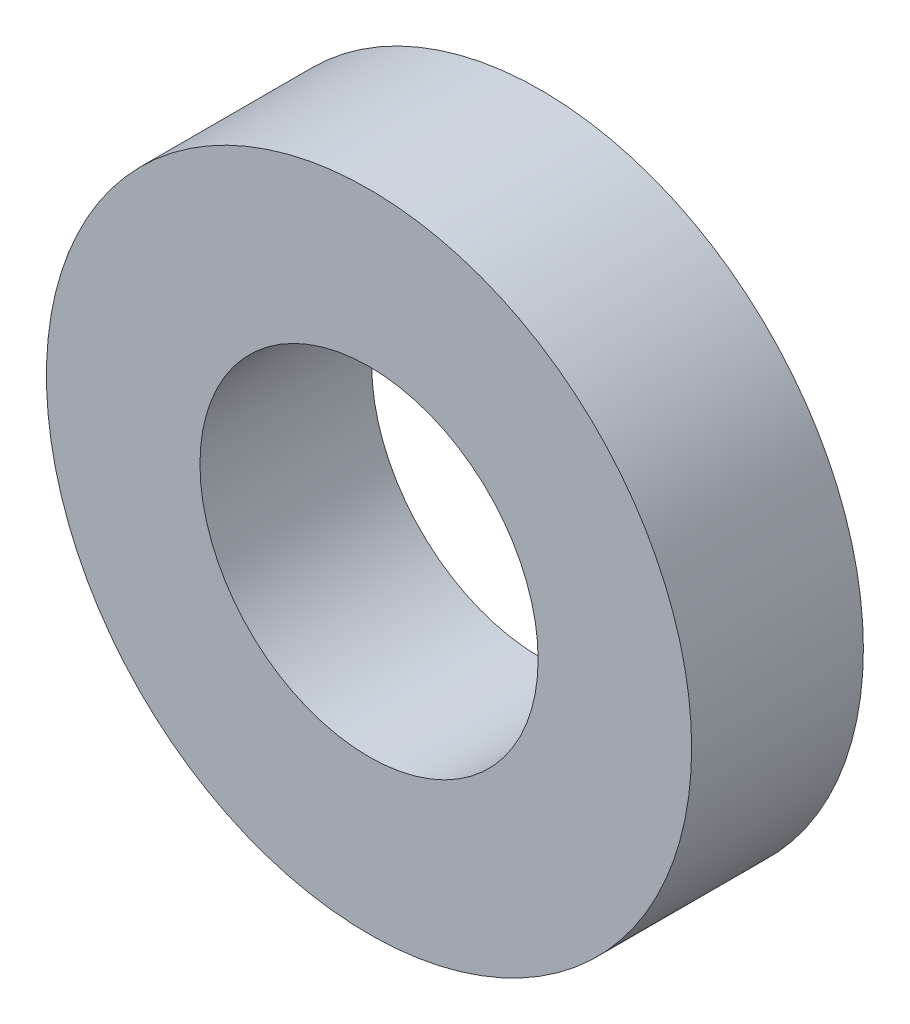
ISO-10303-21;
HEADER;
FILE_DESCRIPTION(('STEP AP214'),'2;1');
FILE_NAME('part.step','',(''),(''),'','','');
FILE_SCHEMA(('AUTOMOTIVE_DESIGN { 1 0 10303 214 1 1 1 1 }'));
ENDSEC;
DATA;
#1=APPLICATION_CONTEXT('core data for automotive mechanical design processes');
#2=APPLICATION_PROTOCOL_DEFINITION('international standard','automotive_design',2000,#1);
#3=PRODUCT_CONTEXT('',#1,'mechanical');
#4=PRODUCT('Part','Part','',(#3));
#5=PRODUCT_RELATED_PRODUCT_CATEGORY('part','',(#4));
#6=PRODUCT_DEFINITION_FORMATION('','',#4);
#7=PRODUCT_DEFINITION_CONTEXT('part definition',#1,'design');
#8=PRODUCT_DEFINITION('design','',#6,#7);
#9=PRODUCT_DEFINITION_SHAPE('','',#8);
#10=(LENGTH_UNIT() NAMED_UNIT(*) SI_UNIT(.MILLI.,.METRE.));
#11=(NAMED_UNIT(*) PLANE_ANGLE_UNIT() SI_UNIT($,.RADIAN.));
#12=(NAMED_UNIT(*) SI_UNIT($,.STERADIAN.) SOLID_ANGLE_UNIT());
#13=UNCERTAINTY_MEASURE_WITH_UNIT(LENGTH_MEASURE(1.E-05),#10,'distance_accuracy_value','');
#14=(GEOMETRIC_REPRESENTATION_CONTEXT(3) GLOBAL_UNCERTAINTY_ASSIGNED_CONTEXT((#13)) GLOBAL_UNIT_ASSIGNED_CONTEXT((#10,
#11,#12)) REPRESENTATION_CONTEXT('',''));
#15=CARTESIAN_POINT('',(0.,0.,0.));
#16=DIRECTION('',(0.,0.,1.));
#17=DIRECTION('',(1.,0.,0.));
#18=AXIS2_PLACEMENT_3D('',#15,#16,#17);
#19=CARTESIAN_POINT('',(0.,0.,4.2));
#20=DIRECTION('',(0.,0.,1.));
#21=DIRECTION('',(1.,0.,0.));
#22=AXIS2_PLACEMENT_3D('',#19,#20,#21);
#23=PLANE('',#22);
#24=CARTESIAN_POINT('',(0.,0.,4.2));
#25=DIRECTION('',(0.,0.,1.));
#26=DIRECTION('',(1.,0.,0.));
#27=AXIS2_PLACEMENT_3D('',#24,#25,#26);
#28=CIRCLE('',#27,7.89);
#29=CARTESIAN_POINT('',(7.89,0.,4.2));
#30=VERTEX_POINT('',#29);
#31=EDGE_CURVE('E10',#30,#30,#28,.T.);
#32=ORIENTED_EDGE('',*,*,#31,.T.);
#33=EDGE_LOOP('',(#32));
#34=FACE_BOUND('',#33,.T.);
#35=CARTESIAN_POINT('',(0.,0.,4.2));
#36=DIRECTION('',(0.,0.,1.));
#37=DIRECTION('',(1.,0.,0.));
#38=AXIS2_PLACEMENT_3D('',#35,#36,#37);
#39=CIRCLE('',#38,4.135);
#40=CARTESIAN_POINT('',(4.135,0.,4.2));
#41=VERTEX_POINT('',#40);
#42=EDGE_CURVE('E48',#41,#41,#39,.T.);
#43=ORIENTED_EDGE('',*,*,#42,.F.);
#44=EDGE_LOOP('',(#43));
#45=FACE_BOUND('',#44,.T.);
#46=ADVANCED_FACE('F37',(#34,#45),#23,.T.);
#47=CARTESIAN_POINT('',(0.,0.,0.));
#48=DIRECTION('',(0.,0.,1.));
#49=DIRECTION('',(1.,0.,0.));
#50=AXIS2_PLACEMENT_3D('',#47,#48,#49);
#51=PLANE('',#50);
#52=CARTESIAN_POINT('',(0.,0.,0.));
#53=DIRECTION('',(0.,0.,1.));
#54=DIRECTION('',(1.,0.,0.));
#55=AXIS2_PLACEMENT_3D('',#52,#53,#54);
#56=CIRCLE('',#55,7.89);
#57=CARTESIAN_POINT('',(7.89,0.,0.));
#58=VERTEX_POINT('',#57);
#59=EDGE_CURVE('E41',#58,#58,#56,.T.);
#60=ORIENTED_EDGE('',*,*,#59,.F.);
#61=EDGE_LOOP('',(#60));
#62=FACE_BOUND('',#61,.T.);
#63=CARTESIAN_POINT('',(0.,0.,0.));
#64=DIRECTION('',(0.,0.,1.));
#65=DIRECTION('',(1.,0.,0.));
#66=AXIS2_PLACEMENT_3D('',#63,#64,#65);
#67=CIRCLE('',#66,4.135);
#68=CARTESIAN_POINT('',(4.135,0.,0.));
#69=VERTEX_POINT('',#68);
#70=EDGE_CURVE('E50',#69,#69,#67,.T.);
#71=ORIENTED_EDGE('',*,*,#70,.T.);
#72=EDGE_LOOP('',(#71));
#73=FACE_BOUND('',#72,.T.);
#74=ADVANCED_FACE('F60',(#62,#73),#51,.F.);
#75=CARTESIAN_POINT('',(0.,0.,4.2));
#76=DIRECTION('',(0.,0.,-1.));
#77=DIRECTION('',(-1.,0.,0.));
#78=AXIS2_PLACEMENT_3D('',#75,#76,#77);
#79=CYLINDRICAL_SURFACE('',#78,7.89);
#80=ORIENTED_EDGE('',*,*,#31,.F.);
#81=EDGE_LOOP('',(#80));
#82=FACE_BOUND('',#81,.T.);
#83=ORIENTED_EDGE('',*,*,#59,.T.);
#84=EDGE_LOOP('',(#83));
#85=FACE_BOUND('',#84,.T.);
#86=ADVANCED_FACE('F39',(#82,#85),#79,.T.);
#87=CARTESIAN_POINT('',(0.,0.,4.2));
#88=DIRECTION('',(0.,0.,-1.));
#89=DIRECTION('',(-1.,0.,0.));
#90=AXIS2_PLACEMENT_3D('',#87,#88,#89);
#91=CYLINDRICAL_SURFACE('',#90,4.135);
#92=ORIENTED_EDGE('',*,*,#42,.T.);
#93=EDGE_LOOP('',(#92));
#94=FACE_BOUND('',#93,.T.);
#95=ORIENTED_EDGE('',*,*,#70,.F.);
#96=EDGE_LOOP('',(#95));
#97=FACE_BOUND('',#96,.T.);
#98=ADVANCED_FACE('F56',(#94,#97),#91,.F.);
#99=CLOSED_SHELL('',(#46,#74,#86,#98));
#100=MANIFOLD_SOLID_BREP('B2',#99);
#101=ADVANCED_BREP_SHAPE_REPRESENTATION('',(#18,#100),#14);
#102=SHAPE_DEFINITION_REPRESENTATION(#9,#101);
ENDSEC;
END-ISO-10303-21;
